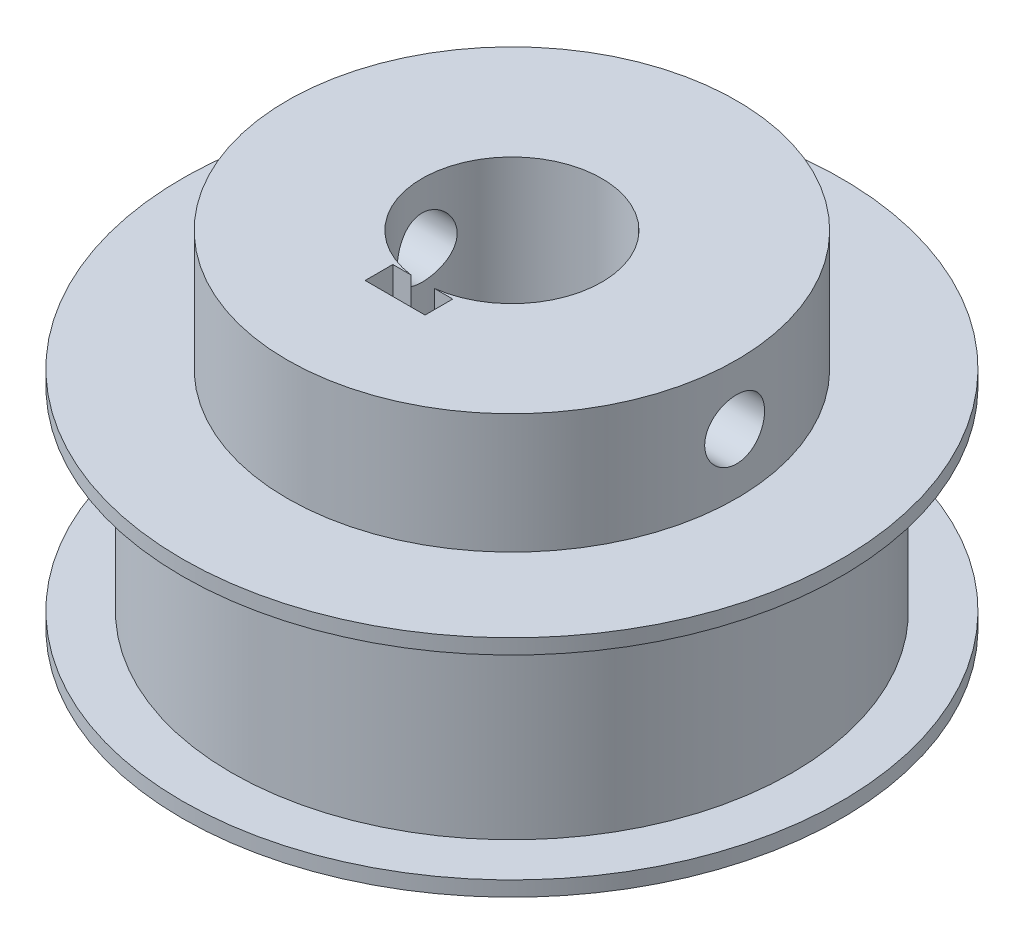
ISO-10303-21;
HEADER;
FILE_DESCRIPTION(('STEP AP214'),'2;1');
FILE_NAME('part.step','',(''),(''),'','','');
FILE_SCHEMA(('AUTOMOTIVE_DESIGN { 1 0 10303 214 1 1 1 1 }'));
ENDSEC;
DATA;
#1=APPLICATION_CONTEXT('core data for automotive mechanical design processes');
#2=APPLICATION_PROTOCOL_DEFINITION('international standard','automotive_design',2000,#1);
#3=PRODUCT_CONTEXT('',#1,'mechanical');
#4=PRODUCT('Part','Part','',(#3));
#5=PRODUCT_RELATED_PRODUCT_CATEGORY('part','',(#4));
#6=PRODUCT_DEFINITION_FORMATION('','',#4);
#7=PRODUCT_DEFINITION_CONTEXT('part definition',#1,'design');
#8=PRODUCT_DEFINITION('design','',#6,#7);
#9=PRODUCT_DEFINITION_SHAPE('','',#8);
#10=(LENGTH_UNIT() NAMED_UNIT(*) SI_UNIT(.MILLI.,.METRE.));
#11=(NAMED_UNIT(*) PLANE_ANGLE_UNIT() SI_UNIT($,.RADIAN.));
#12=(NAMED_UNIT(*) SI_UNIT($,.STERADIAN.) SOLID_ANGLE_UNIT());
#13=UNCERTAINTY_MEASURE_WITH_UNIT(LENGTH_MEASURE(1.E-05),#10,'distance_accuracy_value','');
#14=(GEOMETRIC_REPRESENTATION_CONTEXT(3) GLOBAL_UNCERTAINTY_ASSIGNED_CONTEXT((#13)) GLOBAL_UNIT_ASSIGNED_CONTEXT((#10,
#11,#12)) REPRESENTATION_CONTEXT('',''));
#15=CARTESIAN_POINT('',(0.,0.,0.));
#16=DIRECTION('',(0.,0.,1.));
#17=DIRECTION('',(1.,0.,0.));
#18=AXIS2_PLACEMENT_3D('',#15,#16,#17);
#19=CARTESIAN_POINT('',(24.0154,0.0154,27.9654));
#20=DIRECTION('',(0.,0.,1.));
#21=DIRECTION('',(1.,0.,0.));
#22=AXIS2_PLACEMENT_3D('',#19,#20,#21);
#23=PLANE('',#22);
#24=DIRECTION('',(1.,0.,0.));
#25=VECTOR('',#24,1.);
#26=CARTESIAN_POINT('',(22.0154,23.0154,27.9654));
#27=LINE('',#26,#25);
#28=CARTESIAN_POINT('',(22.788381241687,23.0154,27.9654));
#29=VERTEX_POINT('',#28);
#30=CARTESIAN_POINT('',(24.0154,23.0154,27.9654));
#31=VERTEX_POINT('',#30);
#32=EDGE_CURVE('E79',#29,#31,#27,.T.);
#33=ORIENTED_EDGE('',*,*,#32,.F.);
#34=DIRECTION('',(0.,1.,0.));
#35=VECTOR('',#34,1.);
#36=CARTESIAN_POINT('',(22.788381241687,0.0154,27.9654));
#37=LINE('',#36,#35);
#38=CARTESIAN_POINT('',(22.788381241687,0.0154,27.9654));
#39=VERTEX_POINT('',#38);
#40=EDGE_CURVE('E58',#29,#39,#37,.F.);
#41=ORIENTED_EDGE('',*,*,#40,.T.);
#42=DIRECTION('',(1.,0.,0.));
#43=VECTOR('',#42,1.);
#44=CARTESIAN_POINT('',(24.0154,0.0154,27.9654));
#45=LINE('',#44,#43);
#46=CARTESIAN_POINT('',(24.0154,0.0154,27.9654));
#47=VERTEX_POINT('',#46);
#48=EDGE_CURVE('E97',#39,#47,#45,.T.);
#49=ORIENTED_EDGE('',*,*,#48,.T.);
#50=DIRECTION('',(0.,1.,0.));
#51=VECTOR('',#50,1.);
#52=CARTESIAN_POINT('',(24.0154,0.0154,27.9654));
#53=LINE('',#52,#51);
#54=EDGE_CURVE('E114',#31,#47,#53,.F.);
#55=ORIENTED_EDGE('',*,*,#54,.F.);
#56=EDGE_LOOP('',(#33,#41,#49,#55));
#57=FACE_BOUND('',#56,.T.);
#58=ADVANCED_FACE('F16',(#57),#23,.T.);
#59=CARTESIAN_POINT('',(24.0154,0.0154,27.9654));
#60=DIRECTION('',(0.,0.,1.));
#61=DIRECTION('',(1.,0.,0.));
#62=AXIS2_PLACEMENT_3D('',#59,#60,#61);
#63=PLANE('',#62);
#64=DIRECTION('',(1.,0.,0.));
#65=VECTOR('',#64,1.);
#66=CARTESIAN_POINT('',(22.0154,23.0154,27.9654));
#67=LINE('',#66,#65);
#68=CARTESIAN_POINT('',(20.0154,23.0154,27.9654));
#69=VERTEX_POINT('',#68);
#70=CARTESIAN_POINT('',(21.242418758313,23.0154,27.9654));
#71=VERTEX_POINT('',#70);
#72=EDGE_CURVE('E70',#69,#71,#67,.T.);
#73=ORIENTED_EDGE('',*,*,#72,.F.);
#74=DIRECTION('',(0.,1.,0.));
#75=VECTOR('',#74,1.);
#76=CARTESIAN_POINT('',(20.0154,0.0154,27.9654));
#77=LINE('',#76,#75);
#78=CARTESIAN_POINT('',(20.0154,0.0154,27.9654));
#79=VERTEX_POINT('',#78);
#80=EDGE_CURVE('E109',#69,#79,#77,.F.);
#81=ORIENTED_EDGE('',*,*,#80,.T.);
#82=DIRECTION('',(1.,0.,0.));
#83=VECTOR('',#82,1.);
#84=CARTESIAN_POINT('',(24.0154,0.0154,27.9654));
#85=LINE('',#84,#83);
#86=CARTESIAN_POINT('',(21.242418758313,0.0154,27.9654));
#87=VERTEX_POINT('',#86);
#88=EDGE_CURVE('E35',#79,#87,#85,.T.);
#89=ORIENTED_EDGE('',*,*,#88,.T.);
#90=DIRECTION('',(0.,1.,0.));
#91=VECTOR('',#90,1.);
#92=CARTESIAN_POINT('',(21.242418758313,0.0154,27.9654));
#93=LINE('',#92,#91);
#94=EDGE_CURVE('E66',#87,#71,#93,.T.);
#95=ORIENTED_EDGE('',*,*,#94,.T.);
#96=EDGE_LOOP('',(#73,#81,#89,#95));
#97=FACE_BOUND('',#96,.T.);
#98=ADVANCED_FACE('F67',(#97),#63,.T.);
#99=CARTESIAN_POINT('',(22.0154,23.0154,22.0154));
#100=DIRECTION('',(0.,1.,0.));
#101=DIRECTION('',(0.,0.,1.));
#102=AXIS2_PLACEMENT_3D('',#99,#100,#101);
#103=PLANE('',#102);
#104=DIRECTION('',(0.,0.,1.));
#105=VECTOR('',#104,1.);
#106=CARTESIAN_POINT('',(20.0154,23.0154,27.9654));
#107=LINE('',#106,#105);
#108=CARTESIAN_POINT('',(20.0154,23.0154,29.8154));
#109=VERTEX_POINT('',#108);
#110=EDGE_CURVE('E84',#109,#69,#107,.F.);
#111=ORIENTED_EDGE('',*,*,#110,.T.);
#112=ORIENTED_EDGE('',*,*,#72,.T.);
#113=CARTESIAN_POINT('',(22.0154,23.0154,22.0154));
#114=DIRECTION('',(0.,1.,0.));
#115=DIRECTION('',(0.,0.,1.));
#116=AXIS2_PLACEMENT_3D('',#113,#114,#115);
#117=CIRCLE('',#116,6.);
#118=EDGE_CURVE('E20',#71,#29,#117,.F.);
#119=ORIENTED_EDGE('',*,*,#118,.T.);
#120=ORIENTED_EDGE('',*,*,#32,.T.);
#121=DIRECTION('',(0.,0.,1.));
#122=VECTOR('',#121,1.);
#123=CARTESIAN_POINT('',(24.0154,23.0154,27.9654));
#124=LINE('',#123,#122);
#125=CARTESIAN_POINT('',(24.0154,23.0154,29.8154));
#126=VERTEX_POINT('',#125);
#127=EDGE_CURVE('E117',#126,#31,#124,.F.);
#128=ORIENTED_EDGE('',*,*,#127,.F.);
#129=DIRECTION('',(1.,0.,0.));
#130=VECTOR('',#129,1.);
#131=CARTESIAN_POINT('',(24.0154,23.0154,29.8154));
#132=LINE('',#131,#130);
#133=EDGE_CURVE('E111',#126,#109,#132,.F.);
#134=ORIENTED_EDGE('',*,*,#133,.T.);
#135=EDGE_LOOP('',(#111,#112,#119,#120,#128,#134));
#136=FACE_BOUND('',#135,.T.);
#137=CARTESIAN_POINT('',(22.0154,23.0154,22.0154));
#138=DIRECTION('',(0.,1.,0.));
#139=DIRECTION('',(0.,0.,1.));
#140=AXIS2_PLACEMENT_3D('',#137,#138,#139);
#141=CIRCLE('',#140,15.);
#142=CARTESIAN_POINT('',(22.0154,23.0154,37.0154));
#143=VERTEX_POINT('',#142);
#144=EDGE_CURVE('E105',#143,#143,#141,.F.);
#145=ORIENTED_EDGE('',*,*,#144,.F.);
#146=EDGE_LOOP('',(#145));
#147=FACE_BOUND('',#146,.T.);
#148=ADVANCED_FACE('F80',(#136,#147),#103,.T.);
#149=CARTESIAN_POINT('',(7.0154,19.0154,22.0154));
#150=DIRECTION('',(1.,0.,0.));
#151=DIRECTION('',(0.,0.,-1.));
#152=AXIS2_PLACEMENT_3D('',#149,#150,#151);
#153=CYLINDRICAL_SURFACE('',#152,2.);
#154=CARTESIAN_POINT('',(7.0154,21.0154,22.0154));
#155=CARTESIAN_POINT('',(7.01540167423265,21.0153950386569,22.1271053045066));
#156=CARTESIAN_POINT('',(7.01666195030394,21.0060023570451,22.2389562572012));
#157=CARTESIAN_POINT('',(7.02157106126552,20.9686630690257,22.4596203823882));
#158=CARTESIAN_POINT('',(7.02522484113295,20.9406780491592,22.5684267785024));
#159=CARTESIAN_POINT('',(7.0345097755315,20.8669937025943,22.7796582340819));
#160=CARTESIAN_POINT('',(7.04013875332905,20.8213138704297,22.8820901727006));
#161=CARTESIAN_POINT('',(7.05274785731407,20.7135777549629,23.0777878141298));
#162=CARTESIAN_POINT('',(7.05972743185741,20.6515281540599,23.171057235952));
#163=CARTESIAN_POINT('',(7.0743098677388,20.5123884992463,23.3464233669786));
#164=CARTESIAN_POINT('',(7.08191603570909,20.4352152403139,23.4284537962257));
#165=CARTESIAN_POINT('',(7.09686825507703,20.2681943244164,23.5784440037084));
#166=CARTESIAN_POINT('',(7.10421427959495,20.1783453624667,23.6464023314181));
#167=CARTESIAN_POINT('',(7.11784567574178,19.9881004573928,23.7665592714941));
#168=CARTESIAN_POINT('',(7.1241268772934,19.8876654371517,23.8186965270053));
#169=CARTESIAN_POINT('',(7.13487416539512,19.6793679893949,23.9053387564973));
#170=CARTESIAN_POINT('',(7.13934034593625,19.5715059468267,23.9398446435441));
#171=CARTESIAN_POINT('',(7.14592063142936,19.352094284724,23.9900460448608));
#172=CARTESIAN_POINT('',(7.14804854263444,19.2405703589643,24.0058520152824));
#173=CARTESIAN_POINT('',(7.14975348458494,19.0164340150925,24.0185468104953));
#174=CARTESIAN_POINT('',(7.14933062719481,18.9038216449306,24.0154364648653));
#175=CARTESIAN_POINT('',(7.14599444954763,18.6814793524885,23.9904775157607));
#176=CARTESIAN_POINT('',(7.14309737910973,18.5717354272301,23.9687511729988));
#177=CARTESIAN_POINT('',(7.13516451625121,18.3574640769271,23.9073675846095));
#178=CARTESIAN_POINT('',(7.13012865646066,18.2529368163186,23.8677097741547));
#179=CARTESIAN_POINT('',(7.11846715390681,18.0516863177156,23.7714573850959));
#180=CARTESIAN_POINT('',(7.11183652417625,17.9549888577704,23.7148095373027));
#181=CARTESIAN_POINT('',(7.09773703676896,17.7724339889354,23.5862280212941));
#182=CARTESIAN_POINT('',(7.09026820276537,17.6865762740475,23.514294784728));
#183=CARTESIAN_POINT('',(7.07526271044324,17.5274350920318,23.3565232670516));
#184=CARTESIAN_POINT('',(7.0677259722682,17.4542534084259,23.2705823005436));
#185=CARTESIAN_POINT('',(7.05348381338528,17.3233040853743,23.0875365850251));
#186=CARTESIAN_POINT('',(7.04677877236954,17.2655434722971,22.9904267758408));
#187=CARTESIAN_POINT('',(7.03494989851845,17.1670801141746,22.7876930393653));
#188=CARTESIAN_POINT('',(7.02982800575202,17.126398276628,22.6820588641285));
#189=CARTESIAN_POINT('',(7.02176566901592,17.0634628002273,22.4655170034396));
#190=CARTESIAN_POINT('',(7.01882061186192,17.041170178949,22.3546210031463));
#191=CARTESIAN_POINT('',(7.01655066985677,17.0240462433144,22.2050311046474));
#192=CARTESIAN_POINT('',(7.01612005169483,17.020806381605,22.1671833699625));
#193=CARTESIAN_POINT('',(7.01554443200836,17.0164824158164,22.0913627054801));
#194=CARTESIAN_POINT('',(7.01539943061144,17.0153983127004,22.0533897756267));
#195=CARTESIAN_POINT('',(7.01540167423265,17.0154049613431,21.9036946954933));
#196=CARTESIAN_POINT('',(7.01666195030394,17.0247976429549,21.7918437427988));
#197=CARTESIAN_POINT('',(7.02157106126552,17.0621369309743,21.5711796176118));
#198=CARTESIAN_POINT('',(7.02522484113295,17.0901219508408,21.4623732214975));
#199=CARTESIAN_POINT('',(7.0345097755315,17.1638062974057,21.2511417659181));
#200=CARTESIAN_POINT('',(7.04013875332905,17.2094861295703,21.1487098272993));
#201=CARTESIAN_POINT('',(7.05274785731407,17.3172222450371,20.9530121858702));
#202=CARTESIAN_POINT('',(7.05972743185741,17.3792718459401,20.859742764048));
#203=CARTESIAN_POINT('',(7.0743098677388,17.5184115007537,20.6843766330214));
#204=CARTESIAN_POINT('',(7.08191603570909,17.5955847596861,20.6023462037743));
#205=CARTESIAN_POINT('',(7.09686825507703,17.7626056755836,20.4523559962916));
#206=CARTESIAN_POINT('',(7.10421427959495,17.8524546375333,20.3843976685819));
#207=CARTESIAN_POINT('',(7.11784567574178,18.0426995426072,20.2642407285059));
#208=CARTESIAN_POINT('',(7.12412687729341,18.1431345628484,20.2121034729947));
#209=CARTESIAN_POINT('',(7.13487416539513,18.3514320106051,20.1254612435027));
#210=CARTESIAN_POINT('',(7.13934034593625,18.4592940531734,20.0909553564559));
#211=CARTESIAN_POINT('',(7.14592063142936,18.678705715276,20.0407539551392));
#212=CARTESIAN_POINT('',(7.14804854263444,18.7902296410357,20.0249479847176));
#213=CARTESIAN_POINT('',(7.14975348458494,19.0143659849075,20.0122531895047));
#214=CARTESIAN_POINT('',(7.14933062719481,19.1269783550694,20.0153635351347));
#215=CARTESIAN_POINT('',(7.14599444954763,19.3493206475116,20.0403224842393));
#216=CARTESIAN_POINT('',(7.14309737910973,19.4590645727699,20.0620488270012));
#217=CARTESIAN_POINT('',(7.13516451625121,19.6733359230729,20.1234324153905));
#218=CARTESIAN_POINT('',(7.13012865646066,19.7778631836814,20.1630902258453));
#219=CARTESIAN_POINT('',(7.11846715390681,19.9791136822844,20.2593426149041));
#220=CARTESIAN_POINT('',(7.11183652417625,20.0758111422296,20.3159904626973));
#221=CARTESIAN_POINT('',(7.09773703676896,20.2583660110646,20.4445719787059));
#222=CARTESIAN_POINT('',(7.09026820276537,20.3442237259525,20.5165052152721));
#223=CARTESIAN_POINT('',(7.07526271044324,20.5033649079682,20.6742767329484));
#224=CARTESIAN_POINT('',(7.0677259722682,20.5765465915741,20.7602176994564));
#225=CARTESIAN_POINT('',(7.05348381338528,20.7074959146258,20.9432634149749));
#226=CARTESIAN_POINT('',(7.04677877236954,20.7652565277029,21.0403732241592));
#227=CARTESIAN_POINT('',(7.03494989851845,20.8637198858254,21.2431069606347));
#228=CARTESIAN_POINT('',(7.02982800575202,20.904401723372,21.3487411358715));
#229=CARTESIAN_POINT('',(7.02176566901592,20.9673371997727,21.5652829965605));
#230=CARTESIAN_POINT('',(7.01882061186192,20.989629821051,21.6761789968537));
#231=CARTESIAN_POINT('',(7.01655066985677,21.0067537566856,21.8257688953526));
#232=CARTESIAN_POINT('',(7.01612005169483,21.009993618395,21.8636166300375));
#233=CARTESIAN_POINT('',(7.01554443200836,21.0143175841836,21.9394372945199));
#234=CARTESIAN_POINT('',(7.01539943061144,21.0154016872996,21.9774102243733));
#235=CARTESIAN_POINT('',(7.0154,21.0154,22.0154));
#236=B_SPLINE_CURVE_WITH_KNOTS('',3,(#154,#155,#156,#157,#158,#159,#160,#161,#162,#163,#164,
#165,#166,#167,#168,#169,#170,#171,#172,#173,#174,#175,#176,#177,#178,#179,#180,#181,#182,#183,
#184,#185,#186,#187,#188,#189,#190,#191,#192,#193,#194,#195,#196,#197,#198,#199,#200,#201,#202,
#203,#204,#205,#206,#207,#208,#209,#210,#211,#212,#213,#214,#215,#216,#217,#218,#219,#220,#221,
#222,#223,#224,#225,#226,#227,#228,#229,#230,#231,#232,#233,#234,#235),.UNSPECIFIED.,.T.,.F.,(4,
2,2,2,2,2,2,2,2,2,2,2,2,2,2,2,2,2,2,2,2,2,2,2,2,2,2,2,2,2,2,2,2,2,2,2,2,2,2,2,4),(0.,
0.334971094620303,0.670636431196392,1.00593300922502,1.34109292509754,1.67815133874287,
2.01524447846461,2.35362869053304,2.69199537710992,3.02835326836907,3.36469640869538,
3.69884739684643,4.03300891123244,4.36822928005666,4.70344018373746,5.04122910693761,
5.37917167670539,5.71752675115172,6.05516270604258,6.16908273067098,6.28300280619691,
6.61797390081721,6.9536392373933,7.28893581542192,7.62409573129444,7.96115414493977,
8.29824728466151,8.63663149672993,8.97499818330682,9.31135607456597,9.64769921489229,
9.98185020304333,10.3160117174293,10.6512320862536,10.9864429899344,11.3242319131345,
11.6621744829023,12.0005295573486,12.3381655122395,12.4520855368679,12.5660056123938),.UNSPECIFIED.);
#237=CARTESIAN_POINT('',(7.0154,21.0154,22.0154));
#238=VERTEX_POINT('',#237);
#239=EDGE_CURVE('E163',#238,#238,#236,.T.);
#240=ORIENTED_EDGE('',*,*,#239,.F.);
#241=EDGE_LOOP('',(#240));
#242=FACE_BOUND('',#241,.T.);
#243=CARTESIAN_POINT('',(16.0154,21.0154,22.0154));
#244=CARTESIAN_POINT('',(16.0154043595682,21.0153938758276,21.9064252749393));
#245=CARTESIAN_POINT('',(16.0184010801299,21.0064518239926,21.7973383755887));
#246=CARTESIAN_POINT('',(16.0300810122349,20.9709850223455,21.582264492061));
#247=CARTESIAN_POINT('',(16.0387736877124,20.9444310090371,21.4762829742395));
#248=CARTESIAN_POINT('',(16.0608959406378,20.8747554512746,21.2707226089873));
#249=CARTESIAN_POINT('',(16.0743146432785,20.8316719218384,21.1711296778701));
#250=CARTESIAN_POINT('',(16.1045163702168,20.7302991103528,20.9806197268421));
#251=CARTESIAN_POINT('',(16.1212989834189,20.6720116860738,20.8897016487997));
#252=CARTESIAN_POINT('',(16.1571176564322,20.539750127821,20.7159193387905));
#253=CARTESIAN_POINT('',(16.1762078743554,20.4653414326636,20.6333970301435));
#254=CARTESIAN_POINT('',(16.214192706986,20.3038702640069,20.4817381431084));
#255=CARTESIAN_POINT('',(16.2330872670285,20.2168043512227,20.4126052148986));
#256=CARTESIAN_POINT('',(16.2691333947229,20.0294295470135,20.2877499953921));
#257=CARTESIAN_POINT('',(16.2862192932439,19.9288120584542,20.2324700373652));
#258=CARTESIAN_POINT('',(16.3158939488177,19.7190473133113,20.1397620741755));
#259=CARTESIAN_POINT('',(16.328484098392,19.6099027107198,20.1023285400231));
#260=CARTESIAN_POINT('',(16.347173934234,19.3900535622239,20.047653080016));
#261=CARTESIAN_POINT('',(16.3534780840418,19.2795255936849,20.0297731051489));
#262=CARTESIAN_POINT('',(16.359486867402,19.0568725022719,20.0127177532668));
#263=CARTESIAN_POINT('',(16.3591935396561,18.9447478834854,20.0135365980875));
#264=CARTESIAN_POINT('',(16.3522197078454,18.7275269871845,20.0333601682893));
#265=CARTESIAN_POINT('',(16.3458317126729,18.622343686785,20.0515320821673));
#266=CARTESIAN_POINT('',(16.327866899853,18.4166136323916,20.1041875189971));
#267=CARTESIAN_POINT('',(16.3162894367345,18.316067456884,20.1386730710845));
#268=CARTESIAN_POINT('',(16.2890414093396,18.1205718651865,20.223523004317));
#269=CARTESIAN_POINT('',(16.2733078396073,18.0257388748263,20.2741345224447));
#270=CARTESIAN_POINT('',(16.2395478617949,17.8456535980054,20.3896253627714));
#271=CARTESIAN_POINT('',(16.2215209142595,17.7604035745946,20.4545080445027));
#272=CARTESIAN_POINT('',(16.1840566959222,17.5972311259604,20.6006881631002));
#273=CARTESIAN_POINT('',(16.1645948592965,17.5199211608416,20.6826642666971));
#274=CARTESIAN_POINT('',(16.1272673657991,17.3799588322207,20.8586900300161));
#275=CARTESIAN_POINT('',(16.1094024103662,17.3173128906028,20.9527449516524));
#276=CARTESIAN_POINT('',(16.0770438776968,17.2079607153547,21.1515851698502));
#277=CARTESIAN_POINT('',(16.0625880904525,17.1614306936899,21.2564737476968));
#278=CARTESIAN_POINT('',(16.0389729649489,17.0869439330084,21.4730735986902));
#279=CARTESIAN_POINT('',(16.0298027914738,17.0589491800615,21.5847703915458));
#280=CARTESIAN_POINT('',(16.0210192131945,17.0323088926522,21.7504842581148));
#281=CARTESIAN_POINT('',(16.0189183505598,17.0259759750001,21.8032374122593));
#282=CARTESIAN_POINT('',(16.0161076794638,17.0175200312398,21.9091181477707));
#283=CARTESIAN_POINT('',(16.0153978735467,17.015397012831,21.9622457298222));
#284=CARTESIAN_POINT('',(16.0154043595682,17.0154061241724,22.1243747250607));
#285=CARTESIAN_POINT('',(16.0184010801299,17.0243481760074,22.2334616244113));
#286=CARTESIAN_POINT('',(16.0300810122349,17.0598149776545,22.448535507939));
#287=CARTESIAN_POINT('',(16.0387736877124,17.0863689909629,22.5545170257605));
#288=CARTESIAN_POINT('',(16.0608959406378,17.1560445487254,22.7600773910127));
#289=CARTESIAN_POINT('',(16.0743146432785,17.1991280781616,22.8596703221299));
#290=CARTESIAN_POINT('',(16.1045163702168,17.3005008896472,23.0501802731579));
#291=CARTESIAN_POINT('',(16.1212989834189,17.3587883139262,23.1410983512003));
#292=CARTESIAN_POINT('',(16.1571176564322,17.491049872179,23.3148806612095));
#293=CARTESIAN_POINT('',(16.1762078743554,17.5654585673364,23.3974029698565));
#294=CARTESIAN_POINT('',(16.214192706986,17.7269297359931,23.5490618568916));
#295=CARTESIAN_POINT('',(16.2330872670285,17.8139956487773,23.6181947851014));
#296=CARTESIAN_POINT('',(16.2691333947229,18.0013704529865,23.7430500046079));
#297=CARTESIAN_POINT('',(16.2862192932439,18.1019879415458,23.7983299626348));
#298=CARTESIAN_POINT('',(16.3158939488177,18.3117526866887,23.8910379258245));
#299=CARTESIAN_POINT('',(16.328484098392,18.4208972892802,23.9284714599769));
#300=CARTESIAN_POINT('',(16.347173934234,18.6407464377761,23.983146919984));
#301=CARTESIAN_POINT('',(16.3534780840418,18.7512744063151,24.0010268948511));
#302=CARTESIAN_POINT('',(16.359486867402,18.9739274977281,24.0180822467332));
#303=CARTESIAN_POINT('',(16.3591935396561,19.0860521165146,24.0172634019125));
#304=CARTESIAN_POINT('',(16.3522197078454,19.3032730128155,23.9974398317107));
#305=CARTESIAN_POINT('',(16.3458317126729,19.408456313215,23.9792679178327));
#306=CARTESIAN_POINT('',(16.327866899853,19.6141863676084,23.9266124810029));
#307=CARTESIAN_POINT('',(16.3162894367345,19.714732543116,23.8921269289155));
#308=CARTESIAN_POINT('',(16.2890414093396,19.9102281348135,23.807276995683));
#309=CARTESIAN_POINT('',(16.2733078396073,20.0050611251737,23.7566654775553));
#310=CARTESIAN_POINT('',(16.2395478617949,20.1851464019946,23.6411746372286));
#311=CARTESIAN_POINT('',(16.2215209142595,20.2703964254054,23.5762919554973));
#312=CARTESIAN_POINT('',(16.1840566959222,20.4335688740396,23.4301118368998));
#313=CARTESIAN_POINT('',(16.1645948592965,20.5108788391584,23.3481357333029));
#314=CARTESIAN_POINT('',(16.1272673657991,20.6508411677793,23.1721099699839));
#315=CARTESIAN_POINT('',(16.1094024103662,20.7134871093972,23.0780550483476));
#316=CARTESIAN_POINT('',(16.0770438776968,20.8228392846453,22.8792148301498));
#317=CARTESIAN_POINT('',(16.0625880904525,20.8693693063101,22.7743262523032));
#318=CARTESIAN_POINT('',(16.0389729649489,20.9438560669916,22.5577264013098));
#319=CARTESIAN_POINT('',(16.0298027914738,20.9718508199386,22.4460296084542));
#320=CARTESIAN_POINT('',(16.0210192131945,20.9984911073478,22.2803157418852));
#321=CARTESIAN_POINT('',(16.0189183505598,21.0048240249999,22.2275625877407));
#322=CARTESIAN_POINT('',(16.0161076794638,21.0132799687602,22.1216818522293));
#323=CARTESIAN_POINT('',(16.0153978735467,21.015402987169,22.0685542701778));
#324=CARTESIAN_POINT('',(16.0154,21.0154,22.0154));
#325=B_SPLINE_CURVE_WITH_KNOTS('',3,(#243,#244,#245,#246,#247,#248,#249,#250,#251,#252,#253,
#254,#255,#256,#257,#258,#259,#260,#261,#262,#263,#264,#265,#266,#267,#268,#269,#270,#271,#272,
#273,#274,#275,#276,#277,#278,#279,#280,#281,#282,#283,#284,#285,#286,#287,#288,#289,#290,#291,
#292,#293,#294,#295,#296,#297,#298,#299,#300,#301,#302,#303,#304,#305,#306,#307,#308,#309,#310,
#311,#312,#313,#314,#315,#316,#317,#318,#319,#320,#321,#322,#323,#324),.UNSPECIFIED.,.T.,.F.,(4,
2,2,2,2,2,2,2,2,2,2,2,2,2,2,2,2,2,2,2,2,2,2,2,2,2,2,2,2,2,2,2,2,2,2,2,2,2,2,2,4),(0.,
0.326719078213417,0.653982387409545,0.98049751628952,1.30697276682225,1.64368488946463,
1.98048867688438,2.32696849728116,2.67334090511243,3.00803851018812,3.34263269100474,
3.6619357966006,3.98127862845115,4.30577211013204,4.63034206176842,4.97180786339818,
5.31342292613219,5.65866330563547,6.00319342110391,6.16255590065874,6.32191867166751,
6.64863774988093,6.97590105907706,7.30241618795703,7.62889143848976,7.96560356113215,
8.30240734855189,8.64888716894867,8.99525957677994,9.32995718185563,9.66455136267225,
9.98385446826811,10.3031973001187,10.6276907817995,10.9522607334359,11.2937265350657,
11.6353415977997,11.980581977303,12.3251120927714,12.4844745723262,12.643837343335),.UNSPECIFIED.);
#326=CARTESIAN_POINT('',(16.0154,21.0154,22.0154));
#327=VERTEX_POINT('',#326);
#328=EDGE_CURVE('E86',#327,#327,#325,.T.);
#329=ORIENTED_EDGE('',*,*,#328,.F.);
#330=EDGE_LOOP('',(#329));
#331=FACE_BOUND('',#330,.T.);
#332=ADVANCED_FACE('F197',(#242,#331),#153,.F.);
#333=CARTESIAN_POINT('',(37.0154,19.0154,22.0154));
#334=DIRECTION('',(-1.,0.,0.));
#335=DIRECTION('',(0.,0.,1.));
#336=AXIS2_PLACEMENT_3D('',#333,#334,#335);
#337=CYLINDRICAL_SURFACE('',#336,2.);
#338=CARTESIAN_POINT('',(37.0154,21.0154,22.0154));
#339=CARTESIAN_POINT('',(37.0153983257674,21.0153950386569,21.9036946954934));
#340=CARTESIAN_POINT('',(37.0141380496961,21.0060023570451,21.7918437427988));
#341=CARTESIAN_POINT('',(37.0092289387345,20.9686630690257,21.5711796176118));
#342=CARTESIAN_POINT('',(37.0055751588671,20.9406780491592,21.4623732214976));
#343=CARTESIAN_POINT('',(36.9962902244685,20.8669937025943,21.2511417659181));
#344=CARTESIAN_POINT('',(36.990661246671,20.8213138704297,21.1487098272994));
#345=CARTESIAN_POINT('',(36.9780521426859,20.7135777549629,20.9530121858702));
#346=CARTESIAN_POINT('',(36.9710725681426,20.6515281540599,20.8597427640481));
#347=CARTESIAN_POINT('',(36.9564901322612,20.5123884992463,20.6843766330214));
#348=CARTESIAN_POINT('',(36.9488839642909,20.4352152403139,20.6023462037743));
#349=CARTESIAN_POINT('',(36.933931744923,20.2681943244164,20.4523559962916));
#350=CARTESIAN_POINT('',(36.9265857204051,20.1783453624667,20.3843976685819));
#351=CARTESIAN_POINT('',(36.9129543242582,19.9881004573928,20.2642407285059));
#352=CARTESIAN_POINT('',(36.9066731227066,19.8876654371517,20.2121034729947));
#353=CARTESIAN_POINT('',(36.8959258346049,19.6793679893949,20.1254612435027));
#354=CARTESIAN_POINT('',(36.8914596540638,19.5715059468267,20.0909553564559));
#355=CARTESIAN_POINT('',(36.8848793685706,19.352094284724,20.0407539551392));
#356=CARTESIAN_POINT('',(36.8827514573656,19.2405703589643,20.0249479847177));
#357=CARTESIAN_POINT('',(36.8810465154151,19.0164340150925,20.0122531895047));
#358=CARTESIAN_POINT('',(36.8814693728052,18.9038216449306,20.0153635351347));
#359=CARTESIAN_POINT('',(36.8848055504524,18.6814793524885,20.0403224842393));
#360=CARTESIAN_POINT('',(36.8877026208903,18.5717354272301,20.0620488270012));
#361=CARTESIAN_POINT('',(36.8956354837488,18.3574640769271,20.1234324153905));
#362=CARTESIAN_POINT('',(36.9006713435393,18.2529368163186,20.1630902258453));
#363=CARTESIAN_POINT('',(36.9123328460932,18.0516863177156,20.2593426149041));
#364=CARTESIAN_POINT('',(36.9189634758238,17.9549888577704,20.3159904626973));
#365=CARTESIAN_POINT('',(36.933062963231,17.7724339889354,20.4445719787059));
#366=CARTESIAN_POINT('',(36.9405317972346,17.6865762740475,20.516505215272));
#367=CARTESIAN_POINT('',(36.9555372895568,17.5274350920318,20.6742767329484));
#368=CARTESIAN_POINT('',(36.9630740277318,17.4542534084259,20.7602176994564));
#369=CARTESIAN_POINT('',(36.9773161866147,17.3233040853743,20.9432634149749));
#370=CARTESIAN_POINT('',(36.9840212276305,17.2655434722971,21.0403732241592));
#371=CARTESIAN_POINT('',(36.9958501014816,17.1670801141746,21.2431069606347));
#372=CARTESIAN_POINT('',(37.000971994248,17.126398276628,21.3487411358715));
#373=CARTESIAN_POINT('',(37.0090343309841,17.0634628002273,21.5652829965604));
#374=CARTESIAN_POINT('',(37.0119793881381,17.041170178949,21.6761789968537));
#375=CARTESIAN_POINT('',(37.0142493301432,17.0240462433144,21.8257688953526));
#376=CARTESIAN_POINT('',(37.0146799483052,17.020806381605,21.8636166300375));
#377=CARTESIAN_POINT('',(37.0152555679917,17.0164824158164,21.9394372945199));
#378=CARTESIAN_POINT('',(37.0154005693886,17.0153983127004,21.9774102243733));
#379=CARTESIAN_POINT('',(37.0153983257674,17.0154049613431,22.1271053045067));
#380=CARTESIAN_POINT('',(37.0141380496961,17.0247976429549,22.2389562572012));
#381=CARTESIAN_POINT('',(37.0092289387345,17.0621369309743,22.4596203823882));
#382=CARTESIAN_POINT('',(37.0055751588671,17.0901219508408,22.5684267785024));
#383=CARTESIAN_POINT('',(36.9962902244685,17.1638062974057,22.7796582340819));
#384=CARTESIAN_POINT('',(36.990661246671,17.2094861295703,22.8820901727006));
#385=CARTESIAN_POINT('',(36.9780521426859,17.3172222450371,23.0777878141298));
#386=CARTESIAN_POINT('',(36.9710725681426,17.3792718459401,23.171057235952));
#387=CARTESIAN_POINT('',(36.9564901322612,17.5184115007537,23.3464233669786));
#388=CARTESIAN_POINT('',(36.9488839642909,17.5955847596861,23.4284537962257));
#389=CARTESIAN_POINT('',(36.933931744923,17.7626056755836,23.5784440037084));
#390=CARTESIAN_POINT('',(36.9265857204051,17.8524546375333,23.6464023314181));
#391=CARTESIAN_POINT('',(36.9129543242582,18.0426995426072,23.7665592714941));
#392=CARTESIAN_POINT('',(36.9066731227066,18.1431345628484,23.8186965270053));
#393=CARTESIAN_POINT('',(36.8959258346049,18.3514320106051,23.9053387564973));
#394=CARTESIAN_POINT('',(36.8914596540638,18.4592940531733,23.9398446435441));
#395=CARTESIAN_POINT('',(36.8848793685706,18.678705715276,23.9900460448608));
#396=CARTESIAN_POINT('',(36.8827514573656,18.7902296410357,24.0058520152824));
#397=CARTESIAN_POINT('',(36.8810465154151,19.0143659849075,24.0185468104953));
#398=CARTESIAN_POINT('',(36.8814693728052,19.1269783550694,24.0154364648653));
#399=CARTESIAN_POINT('',(36.8848055504524,19.3493206475116,23.9904775157607));
#400=CARTESIAN_POINT('',(36.8877026208903,19.4590645727699,23.9687511729988));
#401=CARTESIAN_POINT('',(36.8956354837488,19.6733359230729,23.9073675846095));
#402=CARTESIAN_POINT('',(36.9006713435393,19.7778631836814,23.8677097741547));
#403=CARTESIAN_POINT('',(36.9123328460932,19.9791136822844,23.7714573850959));
#404=CARTESIAN_POINT('',(36.9189634758238,20.0758111422296,23.7148095373027));
#405=CARTESIAN_POINT('',(36.933062963231,20.2583660110646,23.5862280212941));
#406=CARTESIAN_POINT('',(36.9405317972346,20.3442237259525,23.514294784728));
#407=CARTESIAN_POINT('',(36.9555372895568,20.5033649079682,23.3565232670516));
#408=CARTESIAN_POINT('',(36.9630740277318,20.5765465915741,23.2705823005436));
#409=CARTESIAN_POINT('',(36.9773161866147,20.7074959146257,23.0875365850251));
#410=CARTESIAN_POINT('',(36.9840212276305,20.7652565277029,22.9904267758408));
#411=CARTESIAN_POINT('',(36.9958501014816,20.8637198858254,22.7876930393653));
#412=CARTESIAN_POINT('',(37.000971994248,20.904401723372,22.6820588641285));
#413=CARTESIAN_POINT('',(37.0090343309841,20.9673371997727,22.4655170034396));
#414=CARTESIAN_POINT('',(37.0119793881381,20.989629821051,22.3546210031463));
#415=CARTESIAN_POINT('',(37.0142493301432,21.0067537566856,22.2050311046474));
#416=CARTESIAN_POINT('',(37.0146799483052,21.009993618395,22.1671833699625));
#417=CARTESIAN_POINT('',(37.0152555679917,21.0143175841836,22.0913627054801));
#418=CARTESIAN_POINT('',(37.0154005693886,21.0154016872996,22.0533897756267));
#419=CARTESIAN_POINT('',(37.0154,21.0154,22.0154));
#420=B_SPLINE_CURVE_WITH_KNOTS('',3,(#338,#339,#340,#341,#342,#343,#344,#345,#346,#347,#348,
#349,#350,#351,#352,#353,#354,#355,#356,#357,#358,#359,#360,#361,#362,#363,#364,#365,#366,#367,
#368,#369,#370,#371,#372,#373,#374,#375,#376,#377,#378,#379,#380,#381,#382,#383,#384,#385,#386,
#387,#388,#389,#390,#391,#392,#393,#394,#395,#396,#397,#398,#399,#400,#401,#402,#403,#404,#405,
#406,#407,#408,#409,#410,#411,#412,#413,#414,#415,#416,#417,#418,#419),.UNSPECIFIED.,.T.,.F.,(4,
2,2,2,2,2,2,2,2,2,2,2,2,2,2,2,2,2,2,2,2,2,2,2,2,2,2,2,2,2,2,2,2,2,2,2,2,2,2,2,4),(0.,
0.3349710946203,0.670636431196388,1.00593300922501,1.34109292509753,1.67815133874286,
2.0152444784646,2.35362869053303,2.69199537710991,3.02835326836906,3.36469640869538,
3.69884739684642,4.03300891123243,4.36822928005666,4.70344018373746,5.04122910693761,
5.37917167670539,5.71752675115171,6.05516270604257,6.16908273067098,6.2830028061969,
6.6179739008172,6.95363923739329,7.28893581542191,7.62409573129443,7.96115414493976,
8.2982472846615,8.63663149672993,8.97499818330681,9.31135607456596,9.64769921489228,
9.98185020304332,10.3160117174293,10.6512320862536,10.9864429899344,11.3242319131345,
11.6621744829023,12.0005295573486,12.3381655122395,12.4520855368679,12.5660056123938),.UNSPECIFIED.);
#421=CARTESIAN_POINT('',(37.0154,21.0154,22.0154));
#422=VERTEX_POINT('',#421);
#423=EDGE_CURVE('E155',#422,#422,#420,.T.);
#424=ORIENTED_EDGE('',*,*,#423,.F.);
#425=EDGE_LOOP('',(#424));
#426=FACE_BOUND('',#425,.T.);
#427=CARTESIAN_POINT('',(28.0154,21.0154,22.0154));
#428=CARTESIAN_POINT('',(28.0154003060189,21.0154005074633,22.1245267257734));
#429=CARTESIAN_POINT('',(28.0123953901509,21.0064394677456,22.2336503890771));
#430=CARTESIAN_POINT('',(28.0007042040656,20.9709417823656,22.4486835217459));
#431=CARTESIAN_POINT('',(27.9920173440431,20.9444033121022,22.5545926562376));
#432=CARTESIAN_POINT('',(27.9699061581289,20.8747615132319,22.7600655790036));
#433=CARTESIAN_POINT('',(27.9564897546171,20.8316858750815,22.8596396517721));
#434=CARTESIAN_POINT('',(27.9262889143468,20.7303176543233,23.0501498736106));
#435=CARTESIAN_POINT('',(27.9095038133556,20.6720220699948,23.1410843139174));
#436=CARTESIAN_POINT('',(27.8736818888601,20.5397483902825,23.3148833500445));
#437=CARTESIAN_POINT('',(27.8545911292757,20.465337531479,23.3974074005966));
#438=CARTESIAN_POINT('',(27.8166062956624,20.3038656905869,23.5490653854042));
#439=CARTESIAN_POINT('',(27.797712265811,20.216801930143,23.6181963709789));
#440=CARTESIAN_POINT('',(27.7616666495455,20.0294297696071,23.7430498844557));
#441=CARTESIAN_POINT('',(27.7445807855138,19.9288125205358,23.7983297164421));
#442=CARTESIAN_POINT('',(27.714906108372,19.7190478110829,23.8910377477554));
#443=CARTESIAN_POINT('',(27.7023159232149,19.6099029656745,23.9284713947735));
#444=CARTESIAN_POINT('',(27.6836260653875,19.3900535570066,23.9831469230183));
#445=CARTESIAN_POINT('',(27.6773219153922,19.2795255830219,24.0010268965435));
#446=CARTESIAN_POINT('',(27.6713131325902,19.0568724916882,24.018082246669));
#447=CARTESIAN_POINT('',(27.6716064604546,18.9447478785816,24.0172634032094));
#448=CARTESIAN_POINT('',(27.6785803001636,18.727526739112,23.9974398074068));
#449=CARTESIAN_POINT('',(27.6849683173507,18.622343194162,23.979267826334));
#450=CARTESIAN_POINT('',(27.702933154491,18.4166131607863,23.9266123256988));
#451=CARTESIAN_POINT('',(27.7145105956822,18.3160672291299,23.8921268531837));
#452=CARTESIAN_POINT('',(27.741758222625,18.120574500817,23.8072781161204));
#453=CARTESIAN_POINT('',(27.7574913158623,18.025743949061,23.7566680974145));
#454=CARTESIAN_POINT('',(27.7912511715145,17.8456581834406,23.6411782126063));
#455=CARTESIAN_POINT('',(27.8092785958093,17.7604057461332,23.576294224728));
#456=CARTESIAN_POINT('',(27.8467465833548,17.5972168036785,23.4300986653645));
#457=CARTESIAN_POINT('',(27.8662117870969,17.5198946109819,23.3481063001526));
#458=CARTESIAN_POINT('',(27.9035387677407,17.3799374666732,23.1720791399401));
#459=CARTESIAN_POINT('',(27.9214003907613,17.317303923671,23.0780431913216));
#460=CARTESIAN_POINT('',(27.9537421587559,17.2080073995299,22.8792952260925));
#461=CARTESIAN_POINT('',(27.9681870001608,17.1615090173185,22.7744865528327));
#462=CARTESIAN_POINT('',(27.9918113428887,17.0869936520886,22.557938166729));
#463=CARTESIAN_POINT('',(28.0009926730976,17.0589702491531,22.4462008763099));
#464=CARTESIAN_POINT('',(28.0127525414288,17.0232886679553,22.2241676590586));
#465=CARTESIAN_POINT('',(28.0156000366746,17.0148003816545,22.1140191997297));
#466=CARTESIAN_POINT('',(28.0151780538965,17.0160653471969,21.8938498600795));
#467=CARTESIAN_POINT('',(28.0119096083872,17.0258155199598,21.7838289613607));
#468=CARTESIAN_POINT('',(27.9998004943421,17.0626238154719,21.5703602673915));
#469=CARTESIAN_POINT('',(27.9911239742238,17.089172412099,21.4668143863303));
#470=CARTESIAN_POINT('',(27.9692369366014,17.1581868889335,21.2656880828409));
#471=CARTESIAN_POINT('',(27.9560258409335,17.2006547989356,21.1681084229828));
#472=CARTESIAN_POINT('',(27.9259786257458,17.3015408636816,20.9788234072135));
#473=CARTESIAN_POINT('',(27.9090562951157,17.3603491865663,20.8873400815657));
#474=CARTESIAN_POINT('',(27.8735050783253,17.491788300027,20.7152703397288));
#475=CARTESIAN_POINT('',(27.8548756718766,17.5644233120635,20.6346872644088));
#476=CARTESIAN_POINT('',(27.8169369596089,17.7253575020132,20.4828949843874));
#477=CARTESIAN_POINT('',(27.7976352217486,17.8142184538537,20.4122780615085));
#478=CARTESIAN_POINT('',(27.7613994658942,18.0029431356218,20.2868849553529));
#479=CARTESIAN_POINT('',(27.74446546764,18.1028069572682,20.232108904138));
#480=CARTESIAN_POINT('',(27.7150478358277,18.3107460305798,20.1402061391673));
#481=CARTESIAN_POINT('',(27.7025552158596,18.4188041583375,20.10304373567));
#482=CARTESIAN_POINT('',(27.683616646129,18.6401573000883,20.0476106664813));
#483=CARTESIAN_POINT('',(27.6771679724728,18.7534499308087,20.0293314900921));
#484=CARTESIAN_POINT('',(27.6713571774835,18.9757941920818,20.0128474350453));
#485=CARTESIAN_POINT('',(27.6716480051483,19.0847646805736,20.0136594853832));
#486=CARTESIAN_POINT('',(27.6784253964773,19.3009301498441,20.0329154131026));
#487=CARTESIAN_POINT('',(27.6849115913872,19.4081252359102,20.0513582410828));
#488=CARTESIAN_POINT('',(27.7030904860978,19.6156713260049,20.1046563737413));
#489=CARTESIAN_POINT('',(27.7146819604495,19.716113650009,20.139193307969));
#490=CARTESIAN_POINT('',(27.7417279763694,19.9098548138765,20.2234412684805));
#491=CARTESIAN_POINT('',(27.7571833752679,20.003152062376,20.2731556628924));
#492=CARTESIAN_POINT('',(27.7910565845209,20.1843673398458,20.3888786148331));
#493=CARTESIAN_POINT('',(27.8095742328427,20.2718730037968,20.4555035144708));
#494=CARTESIAN_POINT('',(27.8470671256651,20.4347796267684,20.6021142337287));
#495=CARTESIAN_POINT('',(27.8660424982474,20.5101771513761,20.682103831097));
#496=CARTESIAN_POINT('',(27.9032006105109,20.6496888245784,20.8569168861586));
#497=CARTESIAN_POINT('',(27.9213236360251,20.713248695502,20.9521969730005));
#498=CARTESIAN_POINT('',(27.9539198234522,20.8233808577013,21.1526852851867));
#499=CARTESIAN_POINT('',(27.9683939181586,20.8699574918441,21.2578909637353));
#500=CARTESIAN_POINT('',(27.9915103013708,20.9428432649773,21.470412705598));
#501=CARTESIAN_POINT('',(28.0003842484505,20.9699649325268,21.5774244846472));
#502=CARTESIAN_POINT('',(28.0123281412844,21.0062405613543,21.7947591679795));
#503=CARTESIAN_POINT('',(28.0153996906381,21.0153994869931,21.9050811488625));
#504=CARTESIAN_POINT('',(28.0154,21.0154,22.0154));
#505=B_SPLINE_CURVE_WITH_KNOTS('',3,(#427,#428,#429,#430,#431,#432,#433,#434,#435,#436,#437,
#438,#439,#440,#441,#442,#443,#444,#445,#446,#447,#448,#449,#450,#451,#452,#453,#454,#455,#456,
#457,#458,#459,#460,#461,#462,#463,#464,#465,#466,#467,#468,#469,#470,#471,#472,#473,#474,#475,
#476,#477,#478,#479,#480,#481,#482,#483,#484,#485,#486,#487,#488,#489,#490,#491,#492,#493,#494,
#495,#496,#497,#498,#499,#500,#501,#502,#503,#504),.UNSPECIFIED.,.T.,.F.,(4,2,2,2,2,2,2,2,2,2,2,
2,2,2,2,2,2,2,2,2,2,2,2,2,2,2,2,2,2,2,2,2,2,2,2,2,2,2,4),(0.,0.326974212052023,
0.653982370535039,0.980445345740545,1.3069727555982,1.64369368565512,1.9804886657506,
2.32696769646941,2.67334089385666,3.0080385148368,3.3426326797497,3.6619365310256,
3.98127861710964,4.30576342310261,4.63034205116414,4.97186611622734,5.31342291933236,
5.65836811300715,6.00319337754416,6.33307166350339,6.66289426328353,6.98316315956427,
7.30347290568207,7.63220799687473,7.96104361643782,8.30482045761504,8.64860016469993,
8.9916802765354,9.3346056941168,9.65991332128517,9.9852015870275,10.3043117416083,
10.6234927635196,10.9566013338361,11.2898042224756,11.635993216702,11.9820936230491,
12.3127311674763,12.6432773207628),.UNSPECIFIED.);
#506=CARTESIAN_POINT('',(28.0154,21.0154,22.0154));
#507=VERTEX_POINT('',#506);
#508=EDGE_CURVE('E72',#507,#507,#505,.T.);
#509=ORIENTED_EDGE('',*,*,#508,.F.);
#510=EDGE_LOOP('',(#509));
#511=FACE_BOUND('',#510,.T.);
#512=ADVANCED_FACE('F169',(#426,#511),#337,.F.);
#513=CARTESIAN_POINT('',(22.0154,0.0154,22.0154));
#514=DIRECTION('',(0.,1.,0.));
#515=DIRECTION('',(0.,0.,1.));
#516=AXIS2_PLACEMENT_3D('',#513,#514,#515);
#517=CYLINDRICAL_SURFACE('',#516,6.);
#518=ORIENTED_EDGE('',*,*,#118,.F.);
#519=ORIENTED_EDGE('',*,*,#94,.F.);
#520=CARTESIAN_POINT('',(22.0154,0.0154,22.0154));
#521=DIRECTION('',(0.,1.,0.));
#522=DIRECTION('',(0.,0.,1.));
#523=AXIS2_PLACEMENT_3D('',#520,#521,#522);
#524=CIRCLE('',#523,6.);
#525=EDGE_CURVE('E135',#87,#39,#524,.F.);
#526=ORIENTED_EDGE('',*,*,#525,.T.);
#527=ORIENTED_EDGE('',*,*,#40,.F.);
#528=EDGE_LOOP('',(#518,#519,#526,#527));
#529=FACE_BOUND('',#528,.T.);
#530=ORIENTED_EDGE('',*,*,#328,.T.);
#531=EDGE_LOOP('',(#530));
#532=FACE_BOUND('',#531,.T.);
#533=ORIENTED_EDGE('',*,*,#508,.T.);
#534=EDGE_LOOP('',(#533));
#535=FACE_BOUND('',#534,.T.);
#536=ADVANCED_FACE('F75',(#529,#532,#535),#517,.F.);
#537=CARTESIAN_POINT('',(24.0154,0.0154,27.9654));
#538=DIRECTION('',(-1.,0.,0.));
#539=DIRECTION('',(0.,0.,1.));
#540=AXIS2_PLACEMENT_3D('',#537,#538,#539);
#541=PLANE('',#540);
#542=DIRECTION('',(0.,1.,0.));
#543=VECTOR('',#542,1.);
#544=CARTESIAN_POINT('',(24.0154,0.0154,29.8154));
#545=LINE('',#544,#543);
#546=CARTESIAN_POINT('',(24.0154,0.0154,29.8154));
#547=VERTEX_POINT('',#546);
#548=EDGE_CURVE('E122',#547,#126,#545,.T.);
#549=ORIENTED_EDGE('',*,*,#548,.T.);
#550=ORIENTED_EDGE('',*,*,#127,.T.);
#551=ORIENTED_EDGE('',*,*,#54,.T.);
#552=DIRECTION('',(0.,0.,1.));
#553=VECTOR('',#552,1.);
#554=CARTESIAN_POINT('',(24.0154,0.0154,22.0154));
#555=LINE('',#554,#553);
#556=EDGE_CURVE('E132',#47,#547,#555,.T.);
#557=ORIENTED_EDGE('',*,*,#556,.T.);
#558=EDGE_LOOP('',(#549,#550,#551,#557));
#559=FACE_BOUND('',#558,.T.);
#560=ADVANCED_FACE('F188',(#559),#541,.T.);
#561=CARTESIAN_POINT('',(24.0154,0.0154,29.8154));
#562=DIRECTION('',(0.,0.,1.));
#563=DIRECTION('',(1.,0.,0.));
#564=AXIS2_PLACEMENT_3D('',#561,#562,#563);
#565=PLANE('',#564);
#566=ORIENTED_EDGE('',*,*,#133,.F.);
#567=ORIENTED_EDGE('',*,*,#548,.F.);
#568=DIRECTION('',(1.,0.,0.));
#569=VECTOR('',#568,1.);
#570=CARTESIAN_POINT('',(22.0154,0.0154,29.8154));
#571=LINE('',#570,#569);
#572=CARTESIAN_POINT('',(20.0154,0.0154,29.8154));
#573=VERTEX_POINT('',#572);
#574=EDGE_CURVE('E129',#547,#573,#571,.F.);
#575=ORIENTED_EDGE('',*,*,#574,.T.);
#576=DIRECTION('',(0.,1.,0.));
#577=VECTOR('',#576,1.);
#578=CARTESIAN_POINT('',(20.0154,0.0154,29.8154));
#579=LINE('',#578,#577);
#580=EDGE_CURVE('E106',#573,#109,#579,.T.);
#581=ORIENTED_EDGE('',*,*,#580,.T.);
#582=EDGE_LOOP('',(#566,#567,#575,#581));
#583=FACE_BOUND('',#582,.T.);
#584=ADVANCED_FACE('F184',(#583),#565,.F.);
#585=CARTESIAN_POINT('',(20.0154,0.0154,27.9654));
#586=DIRECTION('',(-1.,0.,0.));
#587=DIRECTION('',(0.,0.,1.));
#588=AXIS2_PLACEMENT_3D('',#585,#586,#587);
#589=PLANE('',#588);
#590=ORIENTED_EDGE('',*,*,#580,.F.);
#591=DIRECTION('',(0.,0.,1.));
#592=VECTOR('',#591,1.);
#593=CARTESIAN_POINT('',(20.0154,0.0154,22.0154));
#594=LINE('',#593,#592);
#595=EDGE_CURVE('E125',#573,#79,#594,.F.);
#596=ORIENTED_EDGE('',*,*,#595,.T.);
#597=ORIENTED_EDGE('',*,*,#80,.F.);
#598=ORIENTED_EDGE('',*,*,#110,.F.);
#599=EDGE_LOOP('',(#590,#596,#597,#598));
#600=FACE_BOUND('',#599,.T.);
#601=ADVANCED_FACE('F178',(#600),#589,.F.);
#602=CARTESIAN_POINT('',(22.0154,15.0154,22.0154));
#603=DIRECTION('',(0.,1.,0.));
#604=DIRECTION('',(0.,0.,1.));
#605=AXIS2_PLACEMENT_3D('',#602,#603,#604);
#606=CYLINDRICAL_SURFACE('',#605,15.);
#607=ORIENTED_EDGE('',*,*,#239,.T.);
#608=EDGE_LOOP('',(#607));
#609=FACE_BOUND('',#608,.T.);
#610=ORIENTED_EDGE('',*,*,#144,.T.);
#611=EDGE_LOOP('',(#610));
#612=FACE_BOUND('',#611,.T.);
#613=ORIENTED_EDGE('',*,*,#423,.T.);
#614=EDGE_LOOP('',(#613));
#615=FACE_BOUND('',#614,.T.);
#616=CARTESIAN_POINT('',(22.0154,15.0154,22.0154));
#617=DIRECTION('',(0.,1.,0.));
#618=DIRECTION('',(0.,0.,1.));
#619=AXIS2_PLACEMENT_3D('',#616,#617,#618);
#620=CIRCLE('',#619,15.);
#621=CARTESIAN_POINT('',(22.0154,15.0154,37.0154));
#622=VERTEX_POINT('',#621);
#623=EDGE_CURVE('E128',#622,#622,#620,.F.);
#624=ORIENTED_EDGE('',*,*,#623,.F.);
#625=EDGE_LOOP('',(#624));
#626=FACE_BOUND('',#625,.T.);
#627=ADVANCED_FACE('F172',(#609,#612,#615,#626),#606,.T.);
#628=CARTESIAN_POINT('',(22.0154,0.0154,22.0154));
#629=DIRECTION('',(0.,1.,0.));
#630=DIRECTION('',(0.,0.,1.));
#631=AXIS2_PLACEMENT_3D('',#628,#629,#630);
#632=PLANE('',#631);
#633=CARTESIAN_POINT('',(22.0154,0.0154,22.0154));
#634=DIRECTION('',(0.,1.,0.));
#635=DIRECTION('',(0.,0.,1.));
#636=AXIS2_PLACEMENT_3D('',#633,#634,#635);
#637=CIRCLE('',#636,22.);
#638=CARTESIAN_POINT('',(22.0154,0.0154,44.0154));
#639=VERTEX_POINT('',#638);
#640=EDGE_CURVE('E149',#639,#639,#637,.T.);
#641=ORIENTED_EDGE('',*,*,#640,.F.);
#642=EDGE_LOOP('',(#641));
#643=FACE_BOUND('',#642,.T.);
#644=ORIENTED_EDGE('',*,*,#595,.F.);
#645=ORIENTED_EDGE('',*,*,#574,.F.);
#646=ORIENTED_EDGE('',*,*,#556,.F.);
#647=ORIENTED_EDGE('',*,*,#48,.F.);
#648=ORIENTED_EDGE('',*,*,#525,.F.);
#649=ORIENTED_EDGE('',*,*,#88,.F.);
#650=EDGE_LOOP('',(#644,#645,#646,#647,#648,#649));
#651=FACE_BOUND('',#650,.T.);
#652=ADVANCED_FACE('F177',(#643,#651),#632,.F.);
#653=CARTESIAN_POINT('',(22.0154,15.0154,22.0154));
#654=DIRECTION('',(0.,1.,0.));
#655=DIRECTION('',(0.,0.,1.));
#656=AXIS2_PLACEMENT_3D('',#653,#654,#655);
#657=PLANE('',#656);
#658=CARTESIAN_POINT('',(22.0154,15.0154,22.0154));
#659=DIRECTION('',(0.,1.,0.));
#660=DIRECTION('',(0.,0.,1.));
#661=AXIS2_PLACEMENT_3D('',#658,#659,#660);
#662=CIRCLE('',#661,22.);
#663=CARTESIAN_POINT('',(22.0154,15.0154,44.0154));
#664=VERTEX_POINT('',#663);
#665=EDGE_CURVE('E146',#664,#664,#662,.F.);
#666=ORIENTED_EDGE('',*,*,#665,.F.);
#667=EDGE_LOOP('',(#666));
#668=FACE_BOUND('',#667,.T.);
#669=ORIENTED_EDGE('',*,*,#623,.T.);
#670=EDGE_LOOP('',(#669));
#671=FACE_BOUND('',#670,.T.);
#672=ADVANCED_FACE('F221',(#668,#671),#657,.T.);
#673=CARTESIAN_POINT('',(22.0154,0.0154,22.0154));
#674=DIRECTION('',(0.,1.,0.));
#675=DIRECTION('',(0.,0.,1.));
#676=AXIS2_PLACEMENT_3D('',#673,#674,#675);
#677=CYLINDRICAL_SURFACE('',#676,22.);
#678=ORIENTED_EDGE('',*,*,#640,.T.);
#679=EDGE_LOOP('',(#678));
#680=FACE_BOUND('',#679,.T.);
#681=CARTESIAN_POINT('',(22.0154,1.0154,22.0154));
#682=DIRECTION('',(0.,1.,0.));
#683=DIRECTION('',(0.,0.,1.));
#684=AXIS2_PLACEMENT_3D('',#681,#682,#683);
#685=CIRCLE('',#684,22.);
#686=CARTESIAN_POINT('',(22.0154,1.0154,44.0154));
#687=VERTEX_POINT('',#686);
#688=EDGE_CURVE('E143',#687,#687,#685,.T.);
#689=ORIENTED_EDGE('',*,*,#688,.F.);
#690=EDGE_LOOP('',(#689));
#691=FACE_BOUND('',#690,.T.);
#692=ADVANCED_FACE('F218',(#680,#691),#677,.T.);
#693=CARTESIAN_POINT('',(22.0154,14.0154,22.0154));
#694=DIRECTION('',(0.,1.,0.));
#695=DIRECTION('',(0.,0.,1.));
#696=AXIS2_PLACEMENT_3D('',#693,#694,#695);
#697=CYLINDRICAL_SURFACE('',#696,22.);
#698=CARTESIAN_POINT('',(22.0154,14.0154,22.0154));
#699=DIRECTION('',(0.,1.,0.));
#700=DIRECTION('',(0.,0.,1.));
#701=AXIS2_PLACEMENT_3D('',#698,#699,#700);
#702=CIRCLE('',#701,22.);
#703=CARTESIAN_POINT('',(22.0154,14.0154,44.0154));
#704=VERTEX_POINT('',#703);
#705=EDGE_CURVE('E140',#704,#704,#702,.T.);
#706=ORIENTED_EDGE('',*,*,#705,.T.);
#707=EDGE_LOOP('',(#706));
#708=FACE_BOUND('',#707,.T.);
#709=ORIENTED_EDGE('',*,*,#665,.T.);
#710=EDGE_LOOP('',(#709));
#711=FACE_BOUND('',#710,.T.);
#712=ADVANCED_FACE('F214',(#708,#711),#697,.T.);
#713=CARTESIAN_POINT('',(22.0154,1.0154,22.0154));
#714=DIRECTION('',(0.,1.,0.));
#715=DIRECTION('',(0.,0.,1.));
#716=AXIS2_PLACEMENT_3D('',#713,#714,#715);
#717=PLANE('',#716);
#718=CARTESIAN_POINT('',(22.0154,1.0154,22.0154));
#719=DIRECTION('',(0.,1.,0.));
#720=DIRECTION('',(0.,0.,1.));
#721=AXIS2_PLACEMENT_3D('',#718,#719,#720);
#722=CIRCLE('',#721,18.717593171027);
#723=CARTESIAN_POINT('',(22.0154,1.0154,40.732993171027));
#724=VERTEX_POINT('',#723);
#725=EDGE_CURVE('E26',#724,#724,#722,.T.);
#726=ORIENTED_EDGE('',*,*,#725,.F.);
#727=EDGE_LOOP('',(#726));
#728=FACE_BOUND('',#727,.T.);
#729=ORIENTED_EDGE('',*,*,#688,.T.);
#730=EDGE_LOOP('',(#729));
#731=FACE_BOUND('',#730,.T.);
#732=ADVANCED_FACE('F207',(#728,#731),#717,.T.);
#733=CARTESIAN_POINT('',(22.0154,14.0154,22.0154));
#734=DIRECTION('',(0.,1.,0.));
#735=DIRECTION('',(0.,0.,1.));
#736=AXIS2_PLACEMENT_3D('',#733,#734,#735);
#737=PLANE('',#736);
#738=CARTESIAN_POINT('',(22.0154,14.0154,22.0154));
#739=DIRECTION('',(0.,1.,0.));
#740=DIRECTION('',(0.,0.,1.));
#741=AXIS2_PLACEMENT_3D('',#738,#739,#740);
#742=CIRCLE('',#741,18.717593171027);
#743=CARTESIAN_POINT('',(22.0154,14.0154,40.732993171027));
#744=VERTEX_POINT('',#743);
#745=EDGE_CURVE('E11',#744,#744,#742,.F.);
#746=ORIENTED_EDGE('',*,*,#745,.F.);
#747=EDGE_LOOP('',(#746));
#748=FACE_BOUND('',#747,.T.);
#749=ORIENTED_EDGE('',*,*,#705,.F.);
#750=EDGE_LOOP('',(#749));
#751=FACE_BOUND('',#750,.T.);
#752=ADVANCED_FACE('F201',(#748,#751),#737,.F.);
#753=CARTESIAN_POINT('',(22.0154,0.0154,22.0154));
#754=DIRECTION('',(0.,1.,0.));
#755=DIRECTION('',(0.,0.,1.));
#756=AXIS2_PLACEMENT_3D('',#753,#754,#755);
#757=CYLINDRICAL_SURFACE('',#756,18.717593171027);
#758=ORIENTED_EDGE('',*,*,#745,.T.);
#759=EDGE_LOOP('',(#758));
#760=FACE_BOUND('',#759,.T.);
#761=ORIENTED_EDGE('',*,*,#725,.T.);
#762=EDGE_LOOP('',(#761));
#763=FACE_BOUND('',#762,.T.);
#764=ADVANCED_FACE('F199',(#760,#763),#757,.T.);
#765=CLOSED_SHELL('',(#58,#98,#148,#332,#512,#536,#560,#584,#601,#627,#652,#672,#692,#712,#732,
#752,#764));
#766=MANIFOLD_SOLID_BREP('B1',#765);
#767=ADVANCED_BREP_SHAPE_REPRESENTATION('',(#18,#766),#14);
#768=SHAPE_DEFINITION_REPRESENTATION(#9,#767);
ENDSEC;
END-ISO-10303-21;
